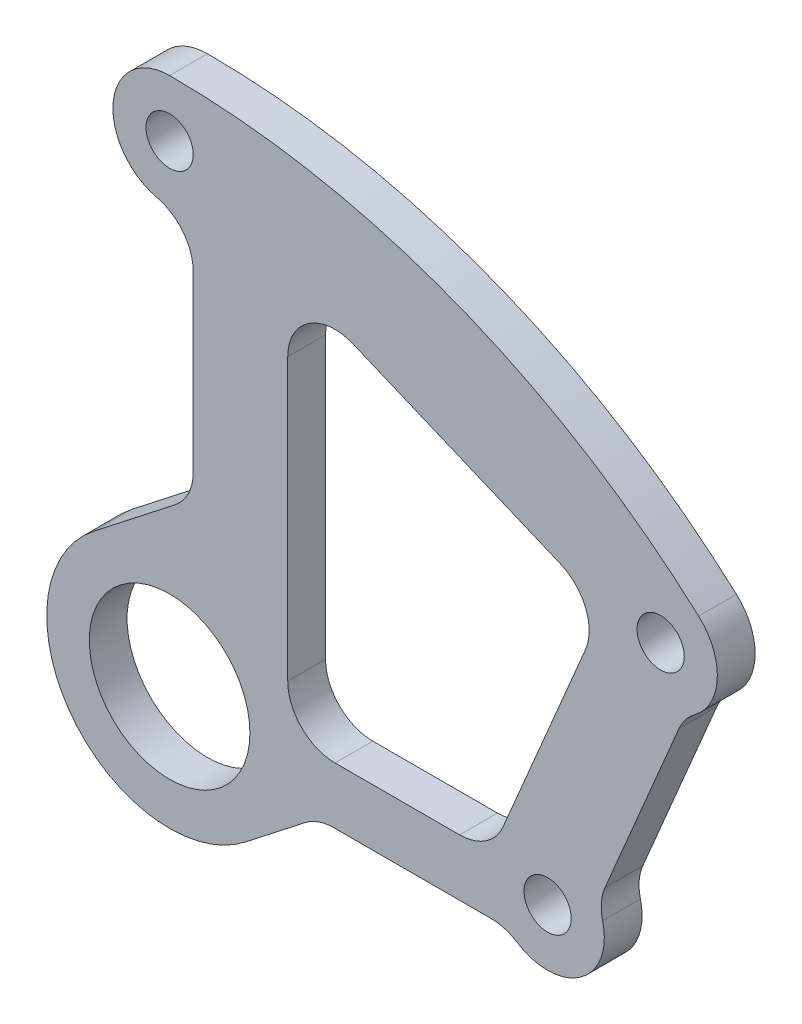
ISO-10303-21;
HEADER;
FILE_DESCRIPTION(('STEP AP214'),'2;1');
FILE_NAME('part.step','',(''),(''),'','','');
FILE_SCHEMA(('AUTOMOTIVE_DESIGN { 1 0 10303 214 1 1 1 1 }'));
ENDSEC;
DATA;
#1=APPLICATION_CONTEXT('core data for automotive mechanical design processes');
#2=APPLICATION_PROTOCOL_DEFINITION('international standard','automotive_design',2000,#1);
#3=PRODUCT_CONTEXT('',#1,'mechanical');
#4=PRODUCT('Part','Part','',(#3));
#5=PRODUCT_RELATED_PRODUCT_CATEGORY('part','',(#4));
#6=PRODUCT_DEFINITION_FORMATION('','',#4);
#7=PRODUCT_DEFINITION_CONTEXT('part definition',#1,'design');
#8=PRODUCT_DEFINITION('design','',#6,#7);
#9=PRODUCT_DEFINITION_SHAPE('','',#8);
#10=(LENGTH_UNIT() NAMED_UNIT(*) SI_UNIT(.MILLI.,.METRE.));
#11=(NAMED_UNIT(*) PLANE_ANGLE_UNIT() SI_UNIT($,.RADIAN.));
#12=(NAMED_UNIT(*) SI_UNIT($,.STERADIAN.) SOLID_ANGLE_UNIT());
#13=UNCERTAINTY_MEASURE_WITH_UNIT(LENGTH_MEASURE(1.E-05),#10,'distance_accuracy_value','');
#14=(GEOMETRIC_REPRESENTATION_CONTEXT(3) GLOBAL_UNCERTAINTY_ASSIGNED_CONTEXT((#13)) GLOBAL_UNIT_ASSIGNED_CONTEXT((#10,
#11,#12)) REPRESENTATION_CONTEXT('',''));
#15=CARTESIAN_POINT('',(0.,0.,0.));
#16=DIRECTION('',(0.,0.,1.));
#17=DIRECTION('',(1.,0.,0.));
#18=AXIS2_PLACEMENT_3D('',#15,#16,#17);
#19=CARTESIAN_POINT('',(0.,0.,4.));
#20=DIRECTION('',(0.,0.,1.));
#21=DIRECTION('',(1.,0.,0.));
#22=AXIS2_PLACEMENT_3D('',#19,#20,#21);
#23=PLANE('',#22);
#24=CARTESIAN_POINT('',(80.,0.,4.));
#25=DIRECTION('',(0.,0.,1.));
#26=DIRECTION('',(1.,0.,0.));
#27=AXIS2_PLACEMENT_3D('',#24,#25,#26);
#28=CIRCLE('',#27,4.99999999999999);
#29=CARTESIAN_POINT('',(85.,0.,4.));
#30=VERTEX_POINT('',#29);
#31=EDGE_CURVE('E269',#30,#30,#28,.T.);
#32=ORIENTED_EDGE('',*,*,#31,.F.);
#33=EDGE_LOOP('',(#32));
#34=FACE_BOUND('',#33,.T.);
#35=CARTESIAN_POINT('',(0.,0.,4.));
#36=DIRECTION('',(0.,0.,1.));
#37=DIRECTION('',(1.,0.,0.));
#38=AXIS2_PLACEMENT_3D('',#35,#36,#37);
#39=CIRCLE('',#38,17.);
#40=CARTESIAN_POINT('',(17.,0.,4.));
#41=VERTEX_POINT('',#40);
#42=EDGE_CURVE('E281',#41,#41,#39,.T.);
#43=ORIENTED_EDGE('',*,*,#42,.F.);
#44=EDGE_LOOP('',(#43));
#45=FACE_BOUND('',#44,.T.);
#46=CARTESIAN_POINT('',(0.,0.,4.));
#47=DIRECTION('',(0.,0.,1.));
#48=DIRECTION('',(1.,0.,0.));
#49=AXIS2_PLACEMENT_3D('',#46,#47,#48);
#50=CIRCLE('',#49,26.);
#51=CARTESIAN_POINT('',(-16.0071983584671,20.4882795937748,4.));
#52=VERTEX_POINT('',#51);
#53=CARTESIAN_POINT('',(16.0071983584671,-20.4882795937748,4.));
#54=VERTEX_POINT('',#53);
#55=EDGE_CURVE('E287',#52,#54,#50,.T.);
#56=ORIENTED_EDGE('',*,*,#55,.T.);
#57=DIRECTION('',(0.788010753606723,0.615661475325657,0.));
#58=VECTOR('',#57,1.);
#59=CARTESIAN_POINT('',(16.0071983584671,-20.4882795937748,4.));
#60=LINE('',#59,#58);
#61=CARTESIAN_POINT('',(28.6569968704309,-10.6051738381714,4.));
#62=VERTEX_POINT('',#61);
#63=EDGE_CURVE('E290',#54,#62,#60,.T.);
#64=ORIENTED_EDGE('',*,*,#63,.T.);
#65=CARTESIAN_POINT('',(34.8136116236875,-18.4852813742387,4.));
#66=DIRECTION('',(0.,0.,-1.));
#67=DIRECTION('',(1.,0.,0.));
#68=AXIS2_PLACEMENT_3D('',#65,#66,#67);
#69=CIRCLE('',#68,10.);
#70=CARTESIAN_POINT('',(34.8136116236875,-8.48528137423866,4.));
#71=VERTEX_POINT('',#70);
#72=EDGE_CURVE('E293',#62,#71,#69,.T.);
#73=ORIENTED_EDGE('',*,*,#72,.T.);
#74=DIRECTION('',(1.,0.,0.));
#75=VECTOR('',#74,1.);
#76=CARTESIAN_POINT('',(68.0712795105583,-8.48528137423865,4.));
#77=LINE('',#76,#75);
#78=CARTESIAN_POINT('',(68.0712795105583,-8.48528137423865,4.));
#79=VERTEX_POINT('',#78);
#80=EDGE_CURVE('E295',#71,#79,#77,.T.);
#81=ORIENTED_EDGE('',*,*,#80,.T.);
#82=CARTESIAN_POINT('',(68.0712795105583,-18.4852813742387,4.));
#83=DIRECTION('',(0.,0.,-1.));
#84=DIRECTION('',(1.,0.,0.));
#85=AXIS2_PLACEMENT_3D('',#82,#83,#84);
#86=CIRCLE('',#85,10.);
#87=CARTESIAN_POINT('',(73.4934251875773,-10.0828807495847,4.));
#88=VERTEX_POINT('',#87);
#89=EDGE_CURVE('E297',#79,#88,#86,.T.);
#90=ORIENTED_EDGE('',*,*,#89,.T.);
#91=CARTESIAN_POINT('',(80.,0.,4.));
#92=DIRECTION('',(0.,0.,1.));
#93=DIRECTION('',(-1.,0.,0.));
#94=AXIS2_PLACEMENT_3D('',#91,#92,#93);
#95=CIRCLE('',#94,12.);
#96=CARTESIAN_POINT('',(91.6432978532744,2.90406871474063,4.));
#97=VERTEX_POINT('',#96);
#98=EDGE_CURVE('E299',#88,#97,#95,.T.);
#99=ORIENTED_EDGE('',*,*,#98,.T.);
#100=CARTESIAN_POINT('',(101.346046064336,5.32412597702448,4.));
#101=DIRECTION('',(0.,0.,-1.));
#102=DIRECTION('',(-1.,0.,0.));
#103=AXIS2_PLACEMENT_3D('',#100,#101,#102);
#104=CIRCLE('',#103,9.99999999999999);
#105=CARTESIAN_POINT('',(92.1378618130365,9.22404171894911,4.));
#106=VERTEX_POINT('',#105);
#107=EDGE_CURVE('E301',#97,#106,#104,.T.);
#108=ORIENTED_EDGE('',*,*,#107,.T.);
#109=DIRECTION('',(0.389991574192462,0.920818425129996,0.));
#110=VECTOR('',#109,1.);
#111=CARTESIAN_POINT('',(107.806206108364,46.2189438480355,4.));
#112=LINE('',#111,#110);
#113=CARTESIAN_POINT('',(107.806206108364,46.2189438480355,4.));
#114=VERTEX_POINT('',#113);
#115=EDGE_CURVE('E303',#106,#114,#112,.T.);
#116=ORIENTED_EDGE('',*,*,#115,.T.);
#117=CARTESIAN_POINT('',(117.014390359664,42.3190281061109,4.));
#118=DIRECTION('',(0.,0.,-1.));
#119=DIRECTION('',(1.,0.,0.));
#120=AXIS2_PLACEMENT_3D('',#117,#118,#119);
#121=CIRCLE('',#120,10.);
#122=CARTESIAN_POINT('',(111.063780402605,50.3558335124238,4.));
#123=VERTEX_POINT('',#122);
#124=EDGE_CURVE('E305',#114,#123,#121,.T.);
#125=ORIENTED_EDGE('',*,*,#124,.T.);
#126=CARTESIAN_POINT('',(103.923048454133,59.9999999999994,4.));
#127=DIRECTION('',(0.,0.,1.));
#128=DIRECTION('',(1.,0.,0.));
#129=AXIS2_PLACEMENT_3D('',#126,#127,#128);
#130=CIRCLE('',#129,12.);
#131=CARTESIAN_POINT('',(111.968703818324,68.9032258064509,4.));
#132=VERTEX_POINT('',#131);
#133=EDGE_CURVE('E307',#123,#132,#130,.T.);
#134=ORIENTED_EDGE('',*,*,#133,.T.);
#135=CARTESIAN_POINT('',(4.30211422042248E-13,-54.9999999999981,4.));
#136=DIRECTION('',(0.,0.,1.));
#137=DIRECTION('',(-1.,0.,0.));
#138=AXIS2_PLACEMENT_3D('',#135,#136,#137);
#139=CIRCLE('',#138,166.999999999998);
#140=CARTESIAN_POINT('',(0.,112.,4.));
#141=VERTEX_POINT('',#140);
#142=EDGE_CURVE('E309',#132,#141,#139,.T.);
#143=ORIENTED_EDGE('',*,*,#142,.T.);
#144=CARTESIAN_POINT('',(0.,100.,4.));
#145=DIRECTION('',(0.,0.,1.));
#146=DIRECTION('',(1.,0.,0.));
#147=AXIS2_PLACEMENT_3D('',#144,#145,#146);
#148=CIRCLE('',#147,12.);
#149=CARTESIAN_POINT('',(-2.72727272727273,88.314026207839,4.));
#150=VERTEX_POINT('',#149);
#151=EDGE_CURVE('E311',#141,#150,#148,.T.);
#152=ORIENTED_EDGE('',*,*,#151,.T.);
#153=CARTESIAN_POINT('',(-5.,78.5757147143715,4.));
#154=DIRECTION('',(0.,0.,-1.));
#155=DIRECTION('',(1.,0.,0.));
#156=AXIS2_PLACEMENT_3D('',#153,#154,#155);
#157=CIRCLE('',#156,10.);
#158=CARTESIAN_POINT('',(5.,78.5757147143715,4.));
#159=VERTEX_POINT('',#158);
#160=EDGE_CURVE('E313',#150,#159,#157,.T.);
#161=ORIENTED_EDGE('',*,*,#160,.T.);
#162=DIRECTION('',(0.,-1.,0.));
#163=VECTOR('',#162,1.);
#164=CARTESIAN_POINT('',(5.,78.5757147143715,4.));
#165=LINE('',#164,#163);
#166=CARTESIAN_POINT('',(5.,41.7782276100792,4.));
#167=VERTEX_POINT('',#166);
#168=EDGE_CURVE('E315',#159,#167,#165,.T.);
#169=ORIENTED_EDGE('',*,*,#168,.T.);
#170=CARTESIAN_POINT('',(-5.,41.7782276100792,4.));
#171=DIRECTION('',(0.,0.,-1.));
#172=DIRECTION('',(1.,0.,0.));
#173=AXIS2_PLACEMENT_3D('',#170,#171,#172);
#174=CIRCLE('',#173,9.99999999999999);
#175=CARTESIAN_POINT('',(1.15661475325657,33.898120074012,4.));
#176=VERTEX_POINT('',#175);
#177=EDGE_CURVE('E317',#167,#176,#174,.T.);
#178=ORIENTED_EDGE('',*,*,#177,.T.);
#179=DIRECTION('',(-0.788010753606723,-0.615661475325658,0.));
#180=VECTOR('',#179,1.);
#181=CARTESIAN_POINT('',(1.15661475325657,33.898120074012,4.));
#182=LINE('',#181,#180);
#183=EDGE_CURVE('E319',#176,#52,#182,.T.);
#184=ORIENTED_EDGE('',*,*,#183,.T.);
#185=EDGE_LOOP('',(#56,#64,#73,#81,#90,#99,#108,#116,#125,#134,#143,#152,#161,#169,#178,#184));
#186=FACE_BOUND('',#185,.T.);
#187=CARTESIAN_POINT('',(0.,100.,4.));
#188=DIRECTION('',(0.,0.,1.));
#189=DIRECTION('',(1.,0.,0.));
#190=AXIS2_PLACEMENT_3D('',#187,#188,#189);
#191=CIRCLE('',#190,5.);
#192=CARTESIAN_POINT('',(5.,100.,4.));
#193=VERTEX_POINT('',#192);
#194=EDGE_CURVE('E275',#193,#193,#191,.T.);
#195=ORIENTED_EDGE('',*,*,#194,.F.);
#196=EDGE_LOOP('',(#195));
#197=FACE_BOUND('',#196,.T.);
#198=CARTESIAN_POINT('',(103.923048454133,59.9999999999994,4.));
#199=DIRECTION('',(0.,0.,1.));
#200=DIRECTION('',(1.,0.,0.));
#201=AXIS2_PLACEMENT_3D('',#198,#199,#200);
#202=CIRCLE('',#201,5.00000000000002);
#203=CARTESIAN_POINT('',(108.923048454133,59.9999999999994,4.));
#204=VERTEX_POINT('',#203);
#205=EDGE_CURVE('E263',#204,#204,#202,.T.);
#206=ORIENTED_EDGE('',*,*,#205,.F.);
#207=EDGE_LOOP('',(#206));
#208=FACE_BOUND('',#207,.T.);
#209=DIRECTION('',(0.,-1.,0.));
#210=VECTOR('',#209,1.);
#211=CARTESIAN_POINT('',(25.,72.9761131709704,4.));
#212=LINE('',#211,#210);
#213=CARTESIAN_POINT('',(25.,72.9761131709704,4.));
#214=VERTEX_POINT('',#213);
#215=CARTESIAN_POINT('',(25.,13.5147186257613,4.));
#216=VERTEX_POINT('',#215);
#217=EDGE_CURVE('E206',#214,#216,#212,.T.);
#218=ORIENTED_EDGE('',*,*,#217,.F.);
#219=CARTESIAN_POINT('',(35.,72.9761131709704,4.));
#220=DIRECTION('',(0.,0.,1.));
#221=DIRECTION('',(-1.,0.,0.));
#222=AXIS2_PLACEMENT_3D('',#219,#220,#221);
#223=CIRCLE('',#222,10.);
#224=CARTESIAN_POINT('',(38.8597035995178,82.2012249927246,4.));
#225=VERTEX_POINT('',#224);
#226=EDGE_CURVE('E198',#225,#214,#223,.T.);
#227=ORIENTED_EDGE('',*,*,#226,.F.);
#228=DIRECTION('',(-0.92251118217542,0.385970359951783,0.));
#229=VECTOR('',#228,1.);
#230=CARTESIAN_POINT('',(82.6575995674588,63.8765802637435,4.));
#231=LINE('',#230,#229);
#232=CARTESIAN_POINT('',(82.6575995674588,63.8765802637436,4.));
#233=VERTEX_POINT('',#232);
#234=EDGE_CURVE('E231',#233,#225,#231,.T.);
#235=ORIENTED_EDGE('',*,*,#234,.F.);
#236=CARTESIAN_POINT('',(78.7978959679409,54.6514684419893,4.));
#237=DIRECTION('',(0.,0.,1.));
#238=DIRECTION('',(1.,0.,0.));
#239=AXIS2_PLACEMENT_3D('',#236,#237,#238);
#240=CIRCLE('',#239,10.);
#241=CARTESIAN_POINT('',(88.0060802192409,50.7515527000647,4.));
#242=VERTEX_POINT('',#241);
#243=EDGE_CURVE('E229',#242,#233,#240,.T.);
#244=ORIENTED_EDGE('',*,*,#243,.F.);
#245=DIRECTION('',(0.389991574192462,0.920818425129995,0.));
#246=VECTOR('',#245,1.);
#247=CARTESIAN_POINT('',(70.5835511080023,9.61480288383671,4.));
#248=LINE('',#247,#246);
#249=CARTESIAN_POINT('',(70.5835511080023,9.61480288383671,4.));
#250=VERTEX_POINT('',#249);
#251=EDGE_CURVE('E227',#250,#242,#248,.T.);
#252=ORIENTED_EDGE('',*,*,#251,.F.);
#253=CARTESIAN_POINT('',(61.3753668567023,13.5147186257613,4.));
#254=DIRECTION('',(0.,0.,1.));
#255=DIRECTION('',(1.,0.,0.));
#256=AXIS2_PLACEMENT_3D('',#253,#254,#255);
#257=CIRCLE('',#256,10.);
#258=CARTESIAN_POINT('',(61.3753668567023,3.51471862576134,4.));
#259=VERTEX_POINT('',#258);
#260=EDGE_CURVE('E225',#259,#250,#257,.T.);
#261=ORIENTED_EDGE('',*,*,#260,.F.);
#262=DIRECTION('',(1.,0.,0.));
#263=VECTOR('',#262,1.);
#264=CARTESIAN_POINT('',(35.,3.51471862576134,4.));
#265=LINE('',#264,#263);
#266=CARTESIAN_POINT('',(35.,3.51471862576134,4.));
#267=VERTEX_POINT('',#266);
#268=EDGE_CURVE('E221',#267,#259,#265,.T.);
#269=ORIENTED_EDGE('',*,*,#268,.F.);
#270=CARTESIAN_POINT('',(35.,13.5147186257613,4.));
#271=DIRECTION('',(0.,0.,1.));
#272=DIRECTION('',(-1.,0.,0.));
#273=AXIS2_PLACEMENT_3D('',#270,#271,#272);
#274=CIRCLE('',#273,10.);
#275=EDGE_CURVE('E219',#216,#267,#274,.T.);
#276=ORIENTED_EDGE('',*,*,#275,.F.);
#277=EDGE_LOOP('',(#218,#227,#235,#244,#252,#261,#269,#276));
#278=FACE_BOUND('',#277,.T.);
#279=ADVANCED_FACE('F37',(#34,#45,#186,#197,#208,#278),#23,.T.);
#280=CARTESIAN_POINT('',(0.,0.,-4.));
#281=DIRECTION('',(0.,0.,1.));
#282=DIRECTION('',(1.,0.,0.));
#283=AXIS2_PLACEMENT_3D('',#280,#281,#282);
#284=PLANE('',#283);
#285=CARTESIAN_POINT('',(103.923048454133,59.9999999999994,-4.));
#286=DIRECTION('',(0.,0.,1.));
#287=DIRECTION('',(1.,0.,0.));
#288=AXIS2_PLACEMENT_3D('',#285,#286,#287);
#289=CIRCLE('',#288,5.00000000000002);
#290=CARTESIAN_POINT('',(108.923048454133,59.9999999999994,-4.));
#291=VERTEX_POINT('',#290);
#292=EDGE_CURVE('E214',#291,#291,#289,.T.);
#293=ORIENTED_EDGE('',*,*,#292,.T.);
#294=EDGE_LOOP('',(#293));
#295=FACE_BOUND('',#294,.T.);
#296=CARTESIAN_POINT('',(80.,0.,-4.));
#297=DIRECTION('',(0.,0.,1.));
#298=DIRECTION('',(1.,0.,0.));
#299=AXIS2_PLACEMENT_3D('',#296,#297,#298);
#300=CIRCLE('',#299,4.99999999999999);
#301=CARTESIAN_POINT('',(85.,0.,-4.));
#302=VERTEX_POINT('',#301);
#303=EDGE_CURVE('E266',#302,#302,#300,.T.);
#304=ORIENTED_EDGE('',*,*,#303,.T.);
#305=EDGE_LOOP('',(#304));
#306=FACE_BOUND('',#305,.T.);
#307=CARTESIAN_POINT('',(0.,100.,-4.));
#308=DIRECTION('',(0.,0.,1.));
#309=DIRECTION('',(1.,0.,0.));
#310=AXIS2_PLACEMENT_3D('',#307,#308,#309);
#311=CIRCLE('',#310,5.);
#312=CARTESIAN_POINT('',(5.,100.,-4.));
#313=VERTEX_POINT('',#312);
#314=EDGE_CURVE('E272',#313,#313,#311,.T.);
#315=ORIENTED_EDGE('',*,*,#314,.T.);
#316=EDGE_LOOP('',(#315));
#317=FACE_BOUND('',#316,.T.);
#318=CARTESIAN_POINT('',(0.,0.,-4.));
#319=DIRECTION('',(0.,0.,1.));
#320=DIRECTION('',(1.,0.,0.));
#321=AXIS2_PLACEMENT_3D('',#318,#319,#320);
#322=CIRCLE('',#321,17.);
#323=CARTESIAN_POINT('',(17.,0.,-4.));
#324=VERTEX_POINT('',#323);
#325=EDGE_CURVE('E278',#324,#324,#322,.T.);
#326=ORIENTED_EDGE('',*,*,#325,.T.);
#327=EDGE_LOOP('',(#326));
#328=FACE_BOUND('',#327,.T.);
#329=CARTESIAN_POINT('',(0.,0.,-4.));
#330=DIRECTION('',(0.,0.,1.));
#331=DIRECTION('',(1.,0.,0.));
#332=AXIS2_PLACEMENT_3D('',#329,#330,#331);
#333=CIRCLE('',#332,26.);
#334=CARTESIAN_POINT('',(-16.0071983584671,20.4882795937748,-4.));
#335=VERTEX_POINT('',#334);
#336=CARTESIAN_POINT('',(16.0071983584671,-20.4882795937748,-4.));
#337=VERTEX_POINT('',#336);
#338=EDGE_CURVE('E284',#335,#337,#333,.T.);
#339=ORIENTED_EDGE('',*,*,#338,.F.);
#340=DIRECTION('',(-0.788010753606723,-0.615661475325658,0.));
#341=VECTOR('',#340,1.);
#342=CARTESIAN_POINT('',(1.15661475325657,33.898120074012,-4.));
#343=LINE('',#342,#341);
#344=CARTESIAN_POINT('',(1.15661475325657,33.898120074012,-4.));
#345=VERTEX_POINT('',#344);
#346=EDGE_CURVE('E291',#345,#335,#343,.T.);
#347=ORIENTED_EDGE('',*,*,#346,.F.);
#348=CARTESIAN_POINT('',(-5.,41.7782276100792,-4.));
#349=DIRECTION('',(0.,0.,-1.));
#350=DIRECTION('',(1.,0.,0.));
#351=AXIS2_PLACEMENT_3D('',#348,#349,#350);
#352=CIRCLE('',#351,9.99999999999999);
#353=CARTESIAN_POINT('',(5.,41.7782276100792,-4.));
#354=VERTEX_POINT('',#353);
#355=EDGE_CURVE('E350',#354,#345,#352,.T.);
#356=ORIENTED_EDGE('',*,*,#355,.F.);
#357=DIRECTION('',(0.,-1.,0.));
#358=VECTOR('',#357,1.);
#359=CARTESIAN_POINT('',(5.,78.5757147143715,-4.));
#360=LINE('',#359,#358);
#361=CARTESIAN_POINT('',(5.,78.5757147143715,-4.));
#362=VERTEX_POINT('',#361);
#363=EDGE_CURVE('E348',#362,#354,#360,.T.);
#364=ORIENTED_EDGE('',*,*,#363,.F.);
#365=CARTESIAN_POINT('',(-5.,78.5757147143715,-4.));
#366=DIRECTION('',(0.,0.,-1.));
#367=DIRECTION('',(1.,0.,0.));
#368=AXIS2_PLACEMENT_3D('',#365,#366,#367);
#369=CIRCLE('',#368,10.);
#370=CARTESIAN_POINT('',(-2.72727272727273,88.314026207839,-4.));
#371=VERTEX_POINT('',#370);
#372=EDGE_CURVE('E346',#371,#362,#369,.T.);
#373=ORIENTED_EDGE('',*,*,#372,.F.);
#374=CARTESIAN_POINT('',(0.,100.,-4.));
#375=DIRECTION('',(0.,0.,1.));
#376=DIRECTION('',(1.,0.,0.));
#377=AXIS2_PLACEMENT_3D('',#374,#375,#376);
#378=CIRCLE('',#377,12.);
#379=CARTESIAN_POINT('',(0.,112.,-4.));
#380=VERTEX_POINT('',#379);
#381=EDGE_CURVE('E344',#380,#371,#378,.T.);
#382=ORIENTED_EDGE('',*,*,#381,.F.);
#383=CARTESIAN_POINT('',(4.30211422042248E-13,-54.9999999999981,-4.));
#384=DIRECTION('',(0.,0.,1.));
#385=DIRECTION('',(-1.,0.,0.));
#386=AXIS2_PLACEMENT_3D('',#383,#384,#385);
#387=CIRCLE('',#386,166.999999999998);
#388=CARTESIAN_POINT('',(111.968703818324,68.9032258064509,-4.));
#389=VERTEX_POINT('',#388);
#390=EDGE_CURVE('E342',#389,#380,#387,.T.);
#391=ORIENTED_EDGE('',*,*,#390,.F.);
#392=CARTESIAN_POINT('',(103.923048454133,59.9999999999994,-4.));
#393=DIRECTION('',(0.,0.,1.));
#394=DIRECTION('',(1.,0.,0.));
#395=AXIS2_PLACEMENT_3D('',#392,#393,#394);
#396=CIRCLE('',#395,12.);
#397=CARTESIAN_POINT('',(111.063780402605,50.3558335124238,-4.));
#398=VERTEX_POINT('',#397);
#399=EDGE_CURVE('E340',#398,#389,#396,.T.);
#400=ORIENTED_EDGE('',*,*,#399,.F.);
#401=CARTESIAN_POINT('',(117.014390359664,42.3190281061109,-4.));
#402=DIRECTION('',(0.,0.,-1.));
#403=DIRECTION('',(1.,0.,0.));
#404=AXIS2_PLACEMENT_3D('',#401,#402,#403);
#405=CIRCLE('',#404,10.);
#406=CARTESIAN_POINT('',(107.806206108364,46.2189438480355,-4.));
#407=VERTEX_POINT('',#406);
#408=EDGE_CURVE('E338',#407,#398,#405,.T.);
#409=ORIENTED_EDGE('',*,*,#408,.F.);
#410=DIRECTION('',(0.389991574192462,0.920818425129996,0.));
#411=VECTOR('',#410,1.);
#412=CARTESIAN_POINT('',(107.806206108364,46.2189438480355,-4.));
#413=LINE('',#412,#411);
#414=CARTESIAN_POINT('',(92.1378618130365,9.22404171894911,-4.));
#415=VERTEX_POINT('',#414);
#416=EDGE_CURVE('E336',#415,#407,#413,.T.);
#417=ORIENTED_EDGE('',*,*,#416,.F.);
#418=CARTESIAN_POINT('',(101.346046064336,5.32412597702448,-4.));
#419=DIRECTION('',(0.,0.,-1.));
#420=DIRECTION('',(-1.,0.,0.));
#421=AXIS2_PLACEMENT_3D('',#418,#419,#420);
#422=CIRCLE('',#421,9.99999999999999);
#423=CARTESIAN_POINT('',(91.6432978532744,2.90406871474063,-4.));
#424=VERTEX_POINT('',#423);
#425=EDGE_CURVE('E334',#424,#415,#422,.T.);
#426=ORIENTED_EDGE('',*,*,#425,.F.);
#427=CARTESIAN_POINT('',(80.,0.,-4.));
#428=DIRECTION('',(0.,0.,1.));
#429=DIRECTION('',(-1.,0.,0.));
#430=AXIS2_PLACEMENT_3D('',#427,#428,#429);
#431=CIRCLE('',#430,12.);
#432=CARTESIAN_POINT('',(73.4934251875773,-10.0828807495847,-4.));
#433=VERTEX_POINT('',#432);
#434=EDGE_CURVE('E332',#433,#424,#431,.T.);
#435=ORIENTED_EDGE('',*,*,#434,.F.);
#436=CARTESIAN_POINT('',(68.0712795105583,-18.4852813742387,-4.));
#437=DIRECTION('',(0.,0.,-1.));
#438=DIRECTION('',(1.,0.,0.));
#439=AXIS2_PLACEMENT_3D('',#436,#437,#438);
#440=CIRCLE('',#439,10.);
#441=CARTESIAN_POINT('',(68.0712795105583,-8.48528137423865,-4.));
#442=VERTEX_POINT('',#441);
#443=EDGE_CURVE('E330',#442,#433,#440,.T.);
#444=ORIENTED_EDGE('',*,*,#443,.F.);
#445=DIRECTION('',(1.,0.,0.));
#446=VECTOR('',#445,1.);
#447=CARTESIAN_POINT('',(68.0712795105583,-8.48528137423865,-4.));
#448=LINE('',#447,#446);
#449=CARTESIAN_POINT('',(34.8136116236875,-8.48528137423866,-4.));
#450=VERTEX_POINT('',#449);
#451=EDGE_CURVE('E328',#450,#442,#448,.T.);
#452=ORIENTED_EDGE('',*,*,#451,.F.);
#453=CARTESIAN_POINT('',(34.8136116236875,-18.4852813742387,-4.));
#454=DIRECTION('',(0.,0.,-1.));
#455=DIRECTION('',(1.,0.,0.));
#456=AXIS2_PLACEMENT_3D('',#453,#454,#455);
#457=CIRCLE('',#456,10.);
#458=CARTESIAN_POINT('',(28.6569968704309,-10.6051738381714,-4.));
#459=VERTEX_POINT('',#458);
#460=EDGE_CURVE('E326',#459,#450,#457,.T.);
#461=ORIENTED_EDGE('',*,*,#460,.F.);
#462=DIRECTION('',(0.788010753606723,0.615661475325657,0.));
#463=VECTOR('',#462,1.);
#464=CARTESIAN_POINT('',(16.0071983584671,-20.4882795937748,-4.));
#465=LINE('',#464,#463);
#466=EDGE_CURVE('E324',#337,#459,#465,.T.);
#467=ORIENTED_EDGE('',*,*,#466,.F.);
#468=EDGE_LOOP('',(#339,#347,#356,#364,#373,#382,#391,#400,#409,#417,#426,#435,#444,#452,#461,#467));
#469=FACE_BOUND('',#468,.T.);
#470=CARTESIAN_POINT('',(35.,72.9761131709704,-4.));
#471=DIRECTION('',(0.,0.,1.));
#472=DIRECTION('',(-1.,0.,0.));
#473=AXIS2_PLACEMENT_3D('',#470,#471,#472);
#474=CIRCLE('',#473,10.);
#475=CARTESIAN_POINT('',(38.8597035995178,82.2012249927246,-4.));
#476=VERTEX_POINT('',#475);
#477=CARTESIAN_POINT('',(25.,72.9761131709704,-4.));
#478=VERTEX_POINT('',#477);
#479=EDGE_CURVE('E60',#476,#478,#474,.T.);
#480=ORIENTED_EDGE('',*,*,#479,.T.);
#481=DIRECTION('',(0.,-1.,0.));
#482=VECTOR('',#481,1.);
#483=CARTESIAN_POINT('',(25.,72.9761131709704,-4.));
#484=LINE('',#483,#482);
#485=CARTESIAN_POINT('',(25.,13.5147186257613,-4.));
#486=VERTEX_POINT('',#485);
#487=EDGE_CURVE('E213',#478,#486,#484,.T.);
#488=ORIENTED_EDGE('',*,*,#487,.T.);
#489=CARTESIAN_POINT('',(35.,13.5147186257613,-4.));
#490=DIRECTION('',(0.,0.,1.));
#491=DIRECTION('',(-1.,0.,0.));
#492=AXIS2_PLACEMENT_3D('',#489,#490,#491);
#493=CIRCLE('',#492,10.);
#494=CARTESIAN_POINT('',(35.,3.51471862576134,-4.));
#495=VERTEX_POINT('',#494);
#496=EDGE_CURVE('E235',#486,#495,#493,.T.);
#497=ORIENTED_EDGE('',*,*,#496,.T.);
#498=DIRECTION('',(1.,0.,0.));
#499=VECTOR('',#498,1.);
#500=CARTESIAN_POINT('',(35.,3.51471862576134,-4.));
#501=LINE('',#500,#499);
#502=CARTESIAN_POINT('',(61.3753668567023,3.51471862576134,-4.));
#503=VERTEX_POINT('',#502);
#504=EDGE_CURVE('E238',#495,#503,#501,.T.);
#505=ORIENTED_EDGE('',*,*,#504,.T.);
#506=CARTESIAN_POINT('',(61.3753668567023,13.5147186257613,-4.));
#507=DIRECTION('',(0.,0.,1.));
#508=DIRECTION('',(1.,0.,0.));
#509=AXIS2_PLACEMENT_3D('',#506,#507,#508);
#510=CIRCLE('',#509,10.);
#511=CARTESIAN_POINT('',(70.5835511080023,9.61480288383671,-4.));
#512=VERTEX_POINT('',#511);
#513=EDGE_CURVE('E241',#503,#512,#510,.T.);
#514=ORIENTED_EDGE('',*,*,#513,.T.);
#515=DIRECTION('',(0.389991574192462,0.920818425129995,0.));
#516=VECTOR('',#515,1.);
#517=CARTESIAN_POINT('',(70.5835511080023,9.61480288383671,-4.));
#518=LINE('',#517,#516);
#519=CARTESIAN_POINT('',(88.0060802192409,50.7515527000647,-4.));
#520=VERTEX_POINT('',#519);
#521=EDGE_CURVE('E244',#512,#520,#518,.T.);
#522=ORIENTED_EDGE('',*,*,#521,.T.);
#523=CARTESIAN_POINT('',(78.7978959679409,54.6514684419893,-4.));
#524=DIRECTION('',(0.,0.,1.));
#525=DIRECTION('',(1.,0.,0.));
#526=AXIS2_PLACEMENT_3D('',#523,#524,#525);
#527=CIRCLE('',#526,10.);
#528=CARTESIAN_POINT('',(82.6575995674588,63.8765802637435,-4.));
#529=VERTEX_POINT('',#528);
#530=EDGE_CURVE('E247',#520,#529,#527,.T.);
#531=ORIENTED_EDGE('',*,*,#530,.T.);
#532=DIRECTION('',(-0.92251118217542,0.385970359951783,0.));
#533=VECTOR('',#532,1.);
#534=CARTESIAN_POINT('',(82.6575995674588,63.8765802637435,-4.));
#535=LINE('',#534,#533);
#536=EDGE_CURVE('E207',#529,#476,#535,.T.);
#537=ORIENTED_EDGE('',*,*,#536,.T.);
#538=EDGE_LOOP('',(#480,#488,#497,#505,#514,#522,#531,#537));
#539=FACE_BOUND('',#538,.T.);
#540=ADVANCED_FACE('F404',(#295,#306,#317,#328,#469,#539),#284,.F.);
#541=CARTESIAN_POINT('',(0.,0.,4.));
#542=DIRECTION('',(0.,0.,-1.));
#543=DIRECTION('',(-1.,0.,0.));
#544=AXIS2_PLACEMENT_3D('',#541,#542,#543);
#545=CYLINDRICAL_SURFACE('',#544,26.);
#546=ORIENTED_EDGE('',*,*,#338,.T.);
#547=DIRECTION('',(0.,0.,-1.));
#548=VECTOR('',#547,1.);
#549=CARTESIAN_POINT('',(16.0071983584671,-20.4882795937748,4.));
#550=LINE('',#549,#548);
#551=EDGE_CURVE('E11',#54,#337,#550,.T.);
#552=ORIENTED_EDGE('',*,*,#551,.F.);
#553=ORIENTED_EDGE('',*,*,#55,.F.);
#554=DIRECTION('',(0.,0.,-1.));
#555=VECTOR('',#554,1.);
#556=CARTESIAN_POINT('',(-16.0071983584671,20.4882795937748,4.));
#557=LINE('',#556,#555);
#558=EDGE_CURVE('E321',#52,#335,#557,.T.);
#559=ORIENTED_EDGE('',*,*,#558,.T.);
#560=EDGE_LOOP('',(#546,#552,#553,#559));
#561=FACE_BOUND('',#560,.T.);
#562=ADVANCED_FACE('F39',(#561),#545,.T.);
#563=CARTESIAN_POINT('',(16.0071983584671,-20.4882795937748,4.));
#564=DIRECTION('',(-0.615661475325657,0.788010753606723,0.));
#565=DIRECTION('',(-0.788010753606723,-0.615661475325657,0.));
#566=AXIS2_PLACEMENT_3D('',#563,#564,#565);
#567=PLANE('',#566);
#568=ORIENTED_EDGE('',*,*,#466,.T.);
#569=DIRECTION('',(0.,0.,-1.));
#570=VECTOR('',#569,1.);
#571=CARTESIAN_POINT('',(28.6569968704309,-10.6051738381714,4.));
#572=LINE('',#571,#570);
#573=EDGE_CURVE('E45',#62,#459,#572,.T.);
#574=ORIENTED_EDGE('',*,*,#573,.F.);
#575=ORIENTED_EDGE('',*,*,#63,.F.);
#576=ORIENTED_EDGE('',*,*,#551,.T.);
#577=EDGE_LOOP('',(#568,#574,#575,#576));
#578=FACE_BOUND('',#577,.T.);
#579=ADVANCED_FACE('F422',(#578),#567,.F.);
#580=CARTESIAN_POINT('',(34.8136116236875,-18.4852813742387,4.));
#581=DIRECTION('',(0.,0.,-1.));
#582=DIRECTION('',(-1.,0.,0.));
#583=AXIS2_PLACEMENT_3D('',#580,#581,#582);
#584=CYLINDRICAL_SURFACE('',#583,10.);
#585=ORIENTED_EDGE('',*,*,#460,.T.);
#586=DIRECTION('',(0.,0.,-1.));
#587=VECTOR('',#586,1.);
#588=CARTESIAN_POINT('',(34.8136116236875,-8.48528137423866,4.));
#589=LINE('',#588,#587);
#590=EDGE_CURVE('E391',#71,#450,#589,.T.);
#591=ORIENTED_EDGE('',*,*,#590,.F.);
#592=ORIENTED_EDGE('',*,*,#72,.F.);
#593=ORIENTED_EDGE('',*,*,#573,.T.);
#594=EDGE_LOOP('',(#585,#591,#592,#593));
#595=FACE_BOUND('',#594,.T.);
#596=ADVANCED_FACE('F398',(#595),#584,.F.);
#597=CARTESIAN_POINT('',(68.0712795105583,-8.48528137423865,4.));
#598=DIRECTION('',(0.,1.,0.));
#599=DIRECTION('',(-1.,0.,0.));
#600=AXIS2_PLACEMENT_3D('',#597,#598,#599);
#601=PLANE('',#600);
#602=ORIENTED_EDGE('',*,*,#451,.T.);
#603=DIRECTION('',(0.,0.,-1.));
#604=VECTOR('',#603,1.);
#605=CARTESIAN_POINT('',(68.0712795105583,-8.48528137423865,4.));
#606=LINE('',#605,#604);
#607=EDGE_CURVE('E388',#79,#442,#606,.T.);
#608=ORIENTED_EDGE('',*,*,#607,.F.);
#609=ORIENTED_EDGE('',*,*,#80,.F.);
#610=ORIENTED_EDGE('',*,*,#590,.T.);
#611=EDGE_LOOP('',(#602,#608,#609,#610));
#612=FACE_BOUND('',#611,.T.);
#613=ADVANCED_FACE('F410',(#612),#601,.F.);
#614=CARTESIAN_POINT('',(68.0712795105583,-18.4852813742387,4.));
#615=DIRECTION('',(0.,0.,-1.));
#616=DIRECTION('',(-1.,0.,0.));
#617=AXIS2_PLACEMENT_3D('',#614,#615,#616);
#618=CYLINDRICAL_SURFACE('',#617,10.);
#619=ORIENTED_EDGE('',*,*,#443,.T.);
#620=DIRECTION('',(0.,0.,-1.));
#621=VECTOR('',#620,1.);
#622=CARTESIAN_POINT('',(73.4934251875773,-10.0828807495847,4.));
#623=LINE('',#622,#621);
#624=EDGE_CURVE('E385',#88,#433,#623,.T.);
#625=ORIENTED_EDGE('',*,*,#624,.F.);
#626=ORIENTED_EDGE('',*,*,#89,.F.);
#627=ORIENTED_EDGE('',*,*,#607,.T.);
#628=EDGE_LOOP('',(#619,#625,#626,#627));
#629=FACE_BOUND('',#628,.T.);
#630=ADVANCED_FACE('F414',(#629),#618,.F.);
#631=CARTESIAN_POINT('',(80.,0.,4.));
#632=DIRECTION('',(0.,0.,-1.));
#633=DIRECTION('',(-1.,0.,0.));
#634=AXIS2_PLACEMENT_3D('',#631,#632,#633);
#635=CYLINDRICAL_SURFACE('',#634,12.);
#636=ORIENTED_EDGE('',*,*,#434,.T.);
#637=DIRECTION('',(0.,0.,-1.));
#638=VECTOR('',#637,1.);
#639=CARTESIAN_POINT('',(91.6432978532744,2.90406871474063,4.));
#640=LINE('',#639,#638);
#641=EDGE_CURVE('E382',#97,#424,#640,.T.);
#642=ORIENTED_EDGE('',*,*,#641,.F.);
#643=ORIENTED_EDGE('',*,*,#98,.F.);
#644=ORIENTED_EDGE('',*,*,#624,.T.);
#645=EDGE_LOOP('',(#636,#642,#643,#644));
#646=FACE_BOUND('',#645,.T.);
#647=ADVANCED_FACE('F475',(#646),#635,.T.);
#648=CARTESIAN_POINT('',(101.346046064336,5.32412597702448,4.));
#649=DIRECTION('',(0.,0.,-1.));
#650=DIRECTION('',(-1.,0.,0.));
#651=AXIS2_PLACEMENT_3D('',#648,#649,#650);
#652=CYLINDRICAL_SURFACE('',#651,9.99999999999999);
#653=ORIENTED_EDGE('',*,*,#425,.T.);
#654=DIRECTION('',(0.,0.,-1.));
#655=VECTOR('',#654,1.);
#656=CARTESIAN_POINT('',(92.1378618130365,9.22404171894911,4.));
#657=LINE('',#656,#655);
#658=EDGE_CURVE('E379',#106,#415,#657,.T.);
#659=ORIENTED_EDGE('',*,*,#658,.F.);
#660=ORIENTED_EDGE('',*,*,#107,.F.);
#661=ORIENTED_EDGE('',*,*,#641,.T.);
#662=EDGE_LOOP('',(#653,#659,#660,#661));
#663=FACE_BOUND('',#662,.T.);
#664=ADVANCED_FACE('F472',(#663),#652,.F.);
#665=CARTESIAN_POINT('',(107.806206108364,46.2189438480355,4.));
#666=DIRECTION('',(-0.920818425129996,0.389991574192462,0.));
#667=DIRECTION('',(-0.389991574192462,-0.920818425129996,0.));
#668=AXIS2_PLACEMENT_3D('',#665,#666,#667);
#669=PLANE('',#668);
#670=ORIENTED_EDGE('',*,*,#416,.T.);
#671=DIRECTION('',(0.,0.,-1.));
#672=VECTOR('',#671,1.);
#673=CARTESIAN_POINT('',(107.806206108364,46.2189438480355,4.));
#674=LINE('',#673,#672);
#675=EDGE_CURVE('E376',#114,#407,#674,.T.);
#676=ORIENTED_EDGE('',*,*,#675,.F.);
#677=ORIENTED_EDGE('',*,*,#115,.F.);
#678=ORIENTED_EDGE('',*,*,#658,.T.);
#679=EDGE_LOOP('',(#670,#676,#677,#678));
#680=FACE_BOUND('',#679,.T.);
#681=ADVANCED_FACE('F468',(#680),#669,.F.);
#682=CARTESIAN_POINT('',(117.014390359664,42.3190281061109,4.));
#683=DIRECTION('',(0.,0.,-1.));
#684=DIRECTION('',(-1.,0.,0.));
#685=AXIS2_PLACEMENT_3D('',#682,#683,#684);
#686=CYLINDRICAL_SURFACE('',#685,10.);
#687=ORIENTED_EDGE('',*,*,#408,.T.);
#688=DIRECTION('',(0.,0.,-1.));
#689=VECTOR('',#688,1.);
#690=CARTESIAN_POINT('',(111.063780402605,50.3558335124238,4.));
#691=LINE('',#690,#689);
#692=EDGE_CURVE('E373',#123,#398,#691,.T.);
#693=ORIENTED_EDGE('',*,*,#692,.F.);
#694=ORIENTED_EDGE('',*,*,#124,.F.);
#695=ORIENTED_EDGE('',*,*,#675,.T.);
#696=EDGE_LOOP('',(#687,#693,#694,#695));
#697=FACE_BOUND('',#696,.T.);
#698=ADVANCED_FACE('F464',(#697),#686,.F.);
#699=CARTESIAN_POINT('',(103.923048454133,59.9999999999994,4.));
#700=DIRECTION('',(0.,0.,-1.));
#701=DIRECTION('',(-1.,0.,0.));
#702=AXIS2_PLACEMENT_3D('',#699,#700,#701);
#703=CYLINDRICAL_SURFACE('',#702,12.);
#704=ORIENTED_EDGE('',*,*,#399,.T.);
#705=DIRECTION('',(0.,0.,-1.));
#706=VECTOR('',#705,1.);
#707=CARTESIAN_POINT('',(111.968703818324,68.9032258064509,4.));
#708=LINE('',#707,#706);
#709=EDGE_CURVE('E370',#132,#389,#708,.T.);
#710=ORIENTED_EDGE('',*,*,#709,.F.);
#711=ORIENTED_EDGE('',*,*,#133,.F.);
#712=ORIENTED_EDGE('',*,*,#692,.T.);
#713=EDGE_LOOP('',(#704,#710,#711,#712));
#714=FACE_BOUND('',#713,.T.);
#715=ADVANCED_FACE('F459',(#714),#703,.T.);
#716=CARTESIAN_POINT('',(4.30211422042248E-13,-54.9999999999981,4.));
#717=DIRECTION('',(0.,0.,-1.));
#718=DIRECTION('',(-1.,0.,0.));
#719=AXIS2_PLACEMENT_3D('',#716,#717,#718);
#720=CYLINDRICAL_SURFACE('',#719,166.999999999998);
#721=ORIENTED_EDGE('',*,*,#390,.T.);
#722=DIRECTION('',(0.,0.,-1.));
#723=VECTOR('',#722,1.);
#724=CARTESIAN_POINT('',(0.,112.,4.));
#725=LINE('',#724,#723);
#726=EDGE_CURVE('E367',#141,#380,#725,.T.);
#727=ORIENTED_EDGE('',*,*,#726,.F.);
#728=ORIENTED_EDGE('',*,*,#142,.F.);
#729=ORIENTED_EDGE('',*,*,#709,.T.);
#730=EDGE_LOOP('',(#721,#727,#728,#729));
#731=FACE_BOUND('',#730,.T.);
#732=ADVANCED_FACE('F453',(#731),#720,.T.);
#733=CARTESIAN_POINT('',(0.,100.,4.));
#734=DIRECTION('',(0.,0.,-1.));
#735=DIRECTION('',(-1.,0.,0.));
#736=AXIS2_PLACEMENT_3D('',#733,#734,#735);
#737=CYLINDRICAL_SURFACE('',#736,12.);
#738=ORIENTED_EDGE('',*,*,#381,.T.);
#739=DIRECTION('',(0.,0.,-1.));
#740=VECTOR('',#739,1.);
#741=CARTESIAN_POINT('',(-2.72727272727273,88.314026207839,4.));
#742=LINE('',#741,#740);
#743=EDGE_CURVE('E364',#150,#371,#742,.T.);
#744=ORIENTED_EDGE('',*,*,#743,.F.);
#745=ORIENTED_EDGE('',*,*,#151,.F.);
#746=ORIENTED_EDGE('',*,*,#726,.T.);
#747=EDGE_LOOP('',(#738,#744,#745,#746));
#748=FACE_BOUND('',#747,.T.);
#749=ADVANCED_FACE('F449',(#748),#737,.T.);
#750=CARTESIAN_POINT('',(-5.,78.5757147143715,4.));
#751=DIRECTION('',(0.,0.,-1.));
#752=DIRECTION('',(-1.,0.,0.));
#753=AXIS2_PLACEMENT_3D('',#750,#751,#752);
#754=CYLINDRICAL_SURFACE('',#753,10.);
#755=ORIENTED_EDGE('',*,*,#372,.T.);
#756=DIRECTION('',(0.,0.,-1.));
#757=VECTOR('',#756,1.);
#758=CARTESIAN_POINT('',(5.,78.5757147143715,4.));
#759=LINE('',#758,#757);
#760=EDGE_CURVE('E361',#159,#362,#759,.T.);
#761=ORIENTED_EDGE('',*,*,#760,.F.);
#762=ORIENTED_EDGE('',*,*,#160,.F.);
#763=ORIENTED_EDGE('',*,*,#743,.T.);
#764=EDGE_LOOP('',(#755,#761,#762,#763));
#765=FACE_BOUND('',#764,.T.);
#766=ADVANCED_FACE('F444',(#765),#754,.F.);
#767=CARTESIAN_POINT('',(5.,78.5757147143715,4.));
#768=DIRECTION('',(1.,0.,0.));
#769=DIRECTION('',(0.,1.,0.));
#770=AXIS2_PLACEMENT_3D('',#767,#768,#769);
#771=PLANE('',#770);
#772=ORIENTED_EDGE('',*,*,#363,.T.);
#773=DIRECTION('',(0.,0.,-1.));
#774=VECTOR('',#773,1.);
#775=CARTESIAN_POINT('',(5.,41.7782276100792,4.));
#776=LINE('',#775,#774);
#777=EDGE_CURVE('E358',#167,#354,#776,.T.);
#778=ORIENTED_EDGE('',*,*,#777,.F.);
#779=ORIENTED_EDGE('',*,*,#168,.F.);
#780=ORIENTED_EDGE('',*,*,#760,.T.);
#781=EDGE_LOOP('',(#772,#778,#779,#780));
#782=FACE_BOUND('',#781,.T.);
#783=ADVANCED_FACE('F438',(#782),#771,.F.);
#784=CARTESIAN_POINT('',(-5.,41.7782276100792,4.));
#785=DIRECTION('',(0.,0.,-1.));
#786=DIRECTION('',(-1.,0.,0.));
#787=AXIS2_PLACEMENT_3D('',#784,#785,#786);
#788=CYLINDRICAL_SURFACE('',#787,9.99999999999999);
#789=ORIENTED_EDGE('',*,*,#355,.T.);
#790=DIRECTION('',(0.,0.,-1.));
#791=VECTOR('',#790,1.);
#792=CARTESIAN_POINT('',(1.15661475325657,33.898120074012,4.));
#793=LINE('',#792,#791);
#794=EDGE_CURVE('E355',#176,#345,#793,.T.);
#795=ORIENTED_EDGE('',*,*,#794,.F.);
#796=ORIENTED_EDGE('',*,*,#177,.F.);
#797=ORIENTED_EDGE('',*,*,#777,.T.);
#798=EDGE_LOOP('',(#789,#795,#796,#797));
#799=FACE_BOUND('',#798,.T.);
#800=ADVANCED_FACE('F434',(#799),#788,.F.);
#801=CARTESIAN_POINT('',(1.15661475325657,33.898120074012,4.));
#802=DIRECTION('',(0.615661475325658,-0.788010753606723,0.));
#803=DIRECTION('',(0.788010753606723,0.615661475325658,0.));
#804=AXIS2_PLACEMENT_3D('',#801,#802,#803);
#805=PLANE('',#804);
#806=ORIENTED_EDGE('',*,*,#346,.T.);
#807=ORIENTED_EDGE('',*,*,#558,.F.);
#808=ORIENTED_EDGE('',*,*,#183,.F.);
#809=ORIENTED_EDGE('',*,*,#794,.T.);
#810=EDGE_LOOP('',(#806,#807,#808,#809));
#811=FACE_BOUND('',#810,.T.);
#812=ADVANCED_FACE('F429',(#811),#805,.F.);
#813=CARTESIAN_POINT('',(0.,0.,4.));
#814=DIRECTION('',(0.,0.,-1.));
#815=DIRECTION('',(-1.,0.,0.));
#816=AXIS2_PLACEMENT_3D('',#813,#814,#815);
#817=CYLINDRICAL_SURFACE('',#816,17.);
#818=ORIENTED_EDGE('',*,*,#42,.T.);
#819=EDGE_LOOP('',(#818));
#820=FACE_BOUND('',#819,.T.);
#821=ORIENTED_EDGE('',*,*,#325,.F.);
#822=EDGE_LOOP('',(#821));
#823=FACE_BOUND('',#822,.T.);
#824=ADVANCED_FACE('F495',(#820,#823),#817,.F.);
#825=CARTESIAN_POINT('',(0.,100.,4.));
#826=DIRECTION('',(0.,0.,-1.));
#827=DIRECTION('',(-1.,0.,0.));
#828=AXIS2_PLACEMENT_3D('',#825,#826,#827);
#829=CYLINDRICAL_SURFACE('',#828,5.);
#830=ORIENTED_EDGE('',*,*,#194,.T.);
#831=EDGE_LOOP('',(#830));
#832=FACE_BOUND('',#831,.T.);
#833=ORIENTED_EDGE('',*,*,#314,.F.);
#834=EDGE_LOOP('',(#833));
#835=FACE_BOUND('',#834,.T.);
#836=ADVANCED_FACE('F557',(#832,#835),#829,.F.);
#837=CARTESIAN_POINT('',(80.,0.,4.));
#838=DIRECTION('',(0.,0.,-1.));
#839=DIRECTION('',(-1.,0.,0.));
#840=AXIS2_PLACEMENT_3D('',#837,#838,#839);
#841=CYLINDRICAL_SURFACE('',#840,4.99999999999999);
#842=ORIENTED_EDGE('',*,*,#31,.T.);
#843=EDGE_LOOP('',(#842));
#844=FACE_BOUND('',#843,.T.);
#845=ORIENTED_EDGE('',*,*,#303,.F.);
#846=EDGE_LOOP('',(#845));
#847=FACE_BOUND('',#846,.T.);
#848=ADVANCED_FACE('F564',(#844,#847),#841,.F.);
#849=CARTESIAN_POINT('',(103.923048454133,59.9999999999994,4.));
#850=DIRECTION('',(0.,0.,-1.));
#851=DIRECTION('',(-1.,0.,0.));
#852=AXIS2_PLACEMENT_3D('',#849,#850,#851);
#853=CYLINDRICAL_SURFACE('',#852,5.00000000000002);
#854=ORIENTED_EDGE('',*,*,#205,.T.);
#855=EDGE_LOOP('',(#854));
#856=FACE_BOUND('',#855,.T.);
#857=ORIENTED_EDGE('',*,*,#292,.F.);
#858=EDGE_LOOP('',(#857));
#859=FACE_BOUND('',#858,.T.);
#860=ADVANCED_FACE('F571',(#856,#859),#853,.F.);
#861=CARTESIAN_POINT('',(35.,72.9761131709704,4.));
#862=DIRECTION('',(0.,0.,-1.));
#863=DIRECTION('',(-1.,0.,0.));
#864=AXIS2_PLACEMENT_3D('',#861,#862,#863);
#865=CYLINDRICAL_SURFACE('',#864,10.);
#866=ORIENTED_EDGE('',*,*,#479,.F.);
#867=DIRECTION('',(0.,0.,-1.));
#868=VECTOR('',#867,1.);
#869=CARTESIAN_POINT('',(38.8597035995178,82.2012249927246,4.));
#870=LINE('',#869,#868);
#871=EDGE_CURVE('E202',#225,#476,#870,.T.);
#872=ORIENTED_EDGE('',*,*,#871,.F.);
#873=ORIENTED_EDGE('',*,*,#226,.T.);
#874=DIRECTION('',(0.,0.,-1.));
#875=VECTOR('',#874,1.);
#876=CARTESIAN_POINT('',(25.,72.9761131709704,4.));
#877=LINE('',#876,#875);
#878=EDGE_CURVE('E201',#214,#478,#877,.T.);
#879=ORIENTED_EDGE('',*,*,#878,.T.);
#880=EDGE_LOOP('',(#866,#872,#873,#879));
#881=FACE_BOUND('',#880,.T.);
#882=ADVANCED_FACE('F200',(#881),#865,.F.);
#883=CARTESIAN_POINT('',(25.,72.9761131709704,4.));
#884=DIRECTION('',(1.,0.,0.));
#885=DIRECTION('',(0.,1.,0.));
#886=AXIS2_PLACEMENT_3D('',#883,#884,#885);
#887=PLANE('',#886);
#888=ORIENTED_EDGE('',*,*,#487,.F.);
#889=ORIENTED_EDGE('',*,*,#878,.F.);
#890=ORIENTED_EDGE('',*,*,#217,.T.);
#891=DIRECTION('',(0.,0.,-1.));
#892=VECTOR('',#891,1.);
#893=CARTESIAN_POINT('',(25.,13.5147186257613,4.));
#894=LINE('',#893,#892);
#895=EDGE_CURVE('E215',#216,#486,#894,.T.);
#896=ORIENTED_EDGE('',*,*,#895,.T.);
#897=EDGE_LOOP('',(#888,#889,#890,#896));
#898=FACE_BOUND('',#897,.T.);
#899=ADVANCED_FACE('F210',(#898),#887,.T.);
#900=CARTESIAN_POINT('',(35.,13.5147186257613,4.));
#901=DIRECTION('',(0.,0.,-1.));
#902=DIRECTION('',(-1.,0.,0.));
#903=AXIS2_PLACEMENT_3D('',#900,#901,#902);
#904=CYLINDRICAL_SURFACE('',#903,10.);
#905=ORIENTED_EDGE('',*,*,#496,.F.);
#906=ORIENTED_EDGE('',*,*,#895,.F.);
#907=ORIENTED_EDGE('',*,*,#275,.T.);
#908=DIRECTION('',(0.,0.,-1.));
#909=VECTOR('',#908,1.);
#910=CARTESIAN_POINT('',(35.,3.51471862576134,4.));
#911=LINE('',#910,#909);
#912=EDGE_CURVE('E260',#267,#495,#911,.T.);
#913=ORIENTED_EDGE('',*,*,#912,.T.);
#914=EDGE_LOOP('',(#905,#906,#907,#913));
#915=FACE_BOUND('',#914,.T.);
#916=ADVANCED_FACE('F592',(#915),#904,.F.);
#917=CARTESIAN_POINT('',(35.,3.51471862576134,4.));
#918=DIRECTION('',(0.,1.,0.));
#919=DIRECTION('',(-1.,0.,0.));
#920=AXIS2_PLACEMENT_3D('',#917,#918,#919);
#921=PLANE('',#920);
#922=ORIENTED_EDGE('',*,*,#504,.F.);
#923=ORIENTED_EDGE('',*,*,#912,.F.);
#924=ORIENTED_EDGE('',*,*,#268,.T.);
#925=DIRECTION('',(0.,0.,-1.));
#926=VECTOR('',#925,1.);
#927=CARTESIAN_POINT('',(61.3753668567023,3.51471862576134,4.));
#928=LINE('',#927,#926);
#929=EDGE_CURVE('E258',#259,#503,#928,.T.);
#930=ORIENTED_EDGE('',*,*,#929,.T.);
#931=EDGE_LOOP('',(#922,#923,#924,#930));
#932=FACE_BOUND('',#931,.T.);
#933=ADVANCED_FACE('F599',(#932),#921,.T.);
#934=CARTESIAN_POINT('',(61.3753668567023,13.5147186257613,4.));
#935=DIRECTION('',(0.,0.,-1.));
#936=DIRECTION('',(-1.,0.,0.));
#937=AXIS2_PLACEMENT_3D('',#934,#935,#936);
#938=CYLINDRICAL_SURFACE('',#937,10.);
#939=ORIENTED_EDGE('',*,*,#513,.F.);
#940=ORIENTED_EDGE('',*,*,#929,.F.);
#941=ORIENTED_EDGE('',*,*,#260,.T.);
#942=DIRECTION('',(0.,0.,-1.));
#943=VECTOR('',#942,1.);
#944=CARTESIAN_POINT('',(70.5835511080023,9.61480288383671,4.));
#945=LINE('',#944,#943);
#946=EDGE_CURVE('E256',#250,#512,#945,.T.);
#947=ORIENTED_EDGE('',*,*,#946,.T.);
#948=EDGE_LOOP('',(#939,#940,#941,#947));
#949=FACE_BOUND('',#948,.T.);
#950=ADVANCED_FACE('F607',(#949),#938,.F.);
#951=CARTESIAN_POINT('',(70.5835511080023,9.61480288383671,4.));
#952=DIRECTION('',(-0.920818425129995,0.389991574192462,0.));
#953=DIRECTION('',(-0.389991574192463,-0.920818425129996,0.));
#954=AXIS2_PLACEMENT_3D('',#951,#952,#953);
#955=PLANE('',#954);
#956=ORIENTED_EDGE('',*,*,#521,.F.);
#957=ORIENTED_EDGE('',*,*,#946,.F.);
#958=ORIENTED_EDGE('',*,*,#251,.T.);
#959=DIRECTION('',(0.,0.,-1.));
#960=VECTOR('',#959,1.);
#961=CARTESIAN_POINT('',(88.0060802192409,50.7515527000647,4.));
#962=LINE('',#961,#960);
#963=EDGE_CURVE('E254',#242,#520,#962,.T.);
#964=ORIENTED_EDGE('',*,*,#963,.T.);
#965=EDGE_LOOP('',(#956,#957,#958,#964));
#966=FACE_BOUND('',#965,.T.);
#967=ADVANCED_FACE('F615',(#966),#955,.T.);
#968=CARTESIAN_POINT('',(78.7978959679409,54.6514684419893,4.));
#969=DIRECTION('',(0.,0.,-1.));
#970=DIRECTION('',(-1.,0.,0.));
#971=AXIS2_PLACEMENT_3D('',#968,#969,#970);
#972=CYLINDRICAL_SURFACE('',#971,10.);
#973=ORIENTED_EDGE('',*,*,#530,.F.);
#974=ORIENTED_EDGE('',*,*,#963,.F.);
#975=ORIENTED_EDGE('',*,*,#243,.T.);
#976=DIRECTION('',(0.,0.,-1.));
#977=VECTOR('',#976,1.);
#978=CARTESIAN_POINT('',(82.6575995674588,63.8765802637435,4.));
#979=LINE('',#978,#977);
#980=EDGE_CURVE('E52',#233,#529,#979,.T.);
#981=ORIENTED_EDGE('',*,*,#980,.T.);
#982=EDGE_LOOP('',(#973,#974,#975,#981));
#983=FACE_BOUND('',#982,.T.);
#984=ADVANCED_FACE('F623',(#983),#972,.F.);
#985=CARTESIAN_POINT('',(82.6575995674588,63.8765802637435,4.));
#986=DIRECTION('',(-0.385970359951783,-0.92251118217542,0.));
#987=DIRECTION('',(0.92251118217542,-0.385970359951783,0.));
#988=AXIS2_PLACEMENT_3D('',#985,#986,#987);
#989=PLANE('',#988);
#990=ORIENTED_EDGE('',*,*,#536,.F.);
#991=ORIENTED_EDGE('',*,*,#980,.F.);
#992=ORIENTED_EDGE('',*,*,#234,.T.);
#993=ORIENTED_EDGE('',*,*,#871,.T.);
#994=EDGE_LOOP('',(#990,#991,#992,#993));
#995=FACE_BOUND('',#994,.T.);
#996=ADVANCED_FACE('F631',(#995),#989,.T.);
#997=CLOSED_SHELL('',(#279,#540,#562,#579,#596,#613,#630,#647,#664,#681,#698,#715,#732,#749,
#766,#783,#800,#812,#824,#836,#848,#860,#882,#899,#916,#933,#950,#967,#984,#996));
#998=MANIFOLD_SOLID_BREP('B2',#997);
#999=ADVANCED_BREP_SHAPE_REPRESENTATION('',(#18,#998),#14);
#1000=SHAPE_DEFINITION_REPRESENTATION(#9,#999);
ENDSEC;
END-ISO-10303-21;
